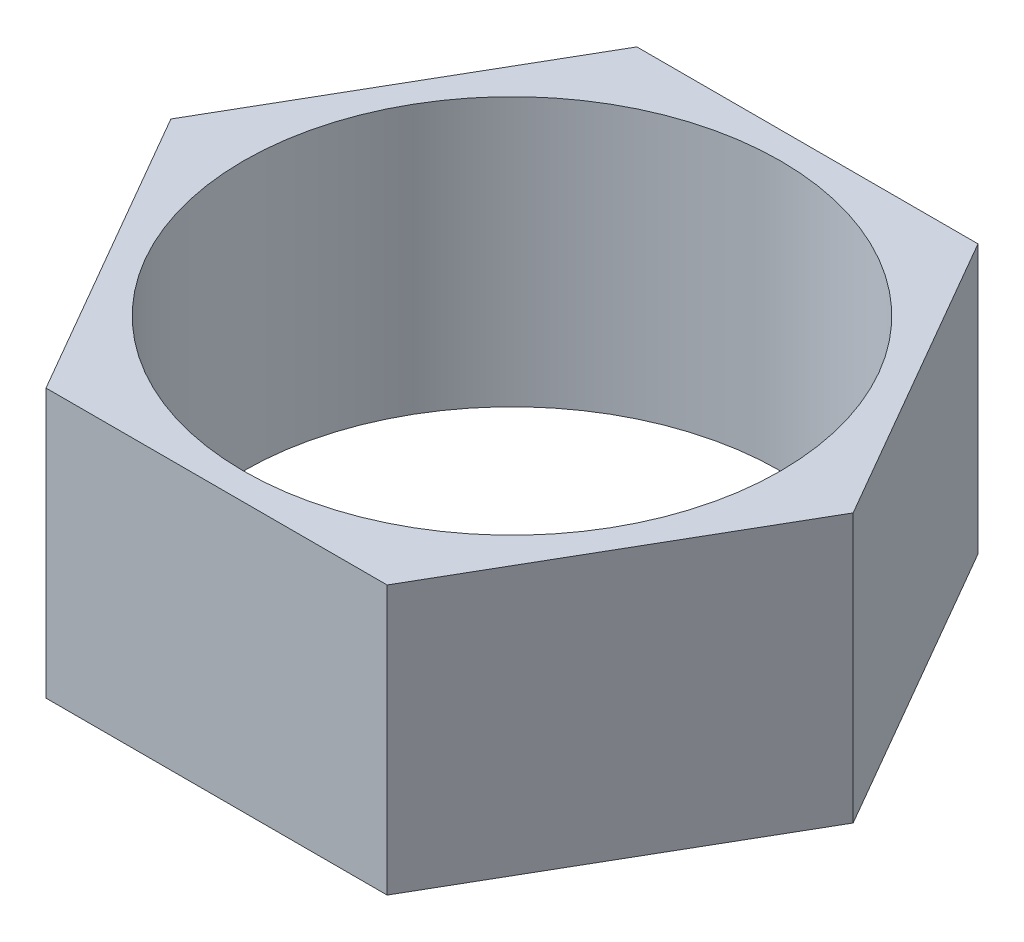
ISO-10303-21;
HEADER;
FILE_DESCRIPTION(('STEP AP214'),'2;1');
FILE_NAME('part.step','',(''),(''),'','','');
FILE_SCHEMA(('AUTOMOTIVE_DESIGN { 1 0 10303 214 1 1 1 1 }'));
ENDSEC;
DATA;
#1=APPLICATION_CONTEXT('core data for automotive mechanical design processes');
#2=APPLICATION_PROTOCOL_DEFINITION('international standard','automotive_design',2000,#1);
#3=PRODUCT_CONTEXT('',#1,'mechanical');
#4=PRODUCT('Part','Part','',(#3));
#5=PRODUCT_RELATED_PRODUCT_CATEGORY('part','',(#4));
#6=PRODUCT_DEFINITION_FORMATION('','',#4);
#7=PRODUCT_DEFINITION_CONTEXT('part definition',#1,'design');
#8=PRODUCT_DEFINITION('design','',#6,#7);
#9=PRODUCT_DEFINITION_SHAPE('','',#8);
#10=(LENGTH_UNIT() NAMED_UNIT(*) SI_UNIT(.MILLI.,.METRE.));
#11=(NAMED_UNIT(*) PLANE_ANGLE_UNIT() SI_UNIT($,.RADIAN.));
#12=(NAMED_UNIT(*) SI_UNIT($,.STERADIAN.) SOLID_ANGLE_UNIT());
#13=UNCERTAINTY_MEASURE_WITH_UNIT(LENGTH_MEASURE(1.E-05),#10,'distance_accuracy_value','');
#14=(GEOMETRIC_REPRESENTATION_CONTEXT(3) GLOBAL_UNCERTAINTY_ASSIGNED_CONTEXT((#13)) GLOBAL_UNIT_ASSIGNED_CONTEXT((#10,
#11,#12)) REPRESENTATION_CONTEXT('',''));
#15=CARTESIAN_POINT('',(0.,0.,0.));
#16=DIRECTION('',(0.,0.,1.));
#17=DIRECTION('',(1.,0.,0.));
#18=AXIS2_PLACEMENT_3D('',#15,#16,#17);
#19=CARTESIAN_POINT('',(0.,10.,0.));
#20=DIRECTION('',(0.,1.,0.));
#21=DIRECTION('',(0.,0.,1.));
#22=AXIS2_PLACEMENT_3D('',#19,#20,#21);
#23=PLANE('',#22);
#24=DIRECTION('',(0.5,0.,-0.866025403784439));
#25=VECTOR('',#24,1.);
#26=CARTESIAN_POINT('',(6.35085296108589,10.,11.));
#27=LINE('',#26,#25);
#28=CARTESIAN_POINT('',(6.35085296108589,10.,11.));
#29=VERTEX_POINT('',#28);
#30=CARTESIAN_POINT('',(12.7017059221718,10.,0.));
#31=VERTEX_POINT('',#30);
#32=EDGE_CURVE('E129',#29,#31,#27,.T.);
#33=ORIENTED_EDGE('',*,*,#32,.T.);
#34=DIRECTION('',(-0.5,0.,-0.866025403784439));
#35=VECTOR('',#34,1.);
#36=CARTESIAN_POINT('',(12.7017059221718,10.,0.));
#37=LINE('',#36,#35);
#38=CARTESIAN_POINT('',(6.35085296108589,10.,-11.));
#39=VERTEX_POINT('',#38);
#40=EDGE_CURVE('E87',#31,#39,#37,.T.);
#41=ORIENTED_EDGE('',*,*,#40,.T.);
#42=DIRECTION('',(-1.,0.,0.));
#43=VECTOR('',#42,1.);
#44=CARTESIAN_POINT('',(6.35085296108589,10.,-11.));
#45=LINE('',#44,#43);
#46=CARTESIAN_POINT('',(-6.35085296108589,10.,-11.));
#47=VERTEX_POINT('',#46);
#48=EDGE_CURVE('E100',#39,#47,#45,.T.);
#49=ORIENTED_EDGE('',*,*,#48,.T.);
#50=DIRECTION('',(-0.5,0.,0.866025403784439));
#51=VECTOR('',#50,1.);
#52=CARTESIAN_POINT('',(-6.35085296108589,10.,-11.));
#53=LINE('',#52,#51);
#54=CARTESIAN_POINT('',(-12.7017059221718,10.,0.));
#55=VERTEX_POINT('',#54);
#56=EDGE_CURVE('E94',#47,#55,#53,.T.);
#57=ORIENTED_EDGE('',*,*,#56,.T.);
#58=DIRECTION('',(0.5,0.,0.866025403784438));
#59=VECTOR('',#58,1.);
#60=CARTESIAN_POINT('',(-12.7017059221718,10.,0.));
#61=LINE('',#60,#59);
#62=CARTESIAN_POINT('',(-6.35085296108589,10.,11.));
#63=VERTEX_POINT('',#62);
#64=EDGE_CURVE('E98',#55,#63,#61,.T.);
#65=ORIENTED_EDGE('',*,*,#64,.T.);
#66=DIRECTION('',(1.,0.,0.));
#67=VECTOR('',#66,1.);
#68=CARTESIAN_POINT('',(-6.35085296108589,10.,11.));
#69=LINE('',#68,#67);
#70=EDGE_CURVE('E50',#63,#29,#69,.T.);
#71=ORIENTED_EDGE('',*,*,#70,.T.);
#72=EDGE_LOOP('',(#33,#41,#49,#57,#65,#71));
#73=FACE_BOUND('',#72,.T.);
#74=CARTESIAN_POINT('',(0.,10.,0.));
#75=DIRECTION('',(0.,1.,0.));
#76=DIRECTION('',(0.,0.,1.));
#77=AXIS2_PLACEMENT_3D('',#74,#75,#76);
#78=CIRCLE('',#77,10.);
#79=CARTESIAN_POINT('',(0.,10.,10.));
#80=VERTEX_POINT('',#79);
#81=EDGE_CURVE('E122',#80,#80,#78,.T.);
#82=ORIENTED_EDGE('',*,*,#81,.F.);
#83=EDGE_LOOP('',(#82));
#84=FACE_BOUND('',#83,.T.);
#85=ADVANCED_FACE('F33',(#73,#84),#23,.T.);
#86=CARTESIAN_POINT('',(0.,0.,0.));
#87=DIRECTION('',(0.,1.,0.));
#88=DIRECTION('',(0.,0.,1.));
#89=AXIS2_PLACEMENT_3D('',#86,#87,#88);
#90=PLANE('',#89);
#91=DIRECTION('',(0.5,0.,-0.866025403784439));
#92=VECTOR('',#91,1.);
#93=CARTESIAN_POINT('',(6.35085296108589,0.,11.));
#94=LINE('',#93,#92);
#95=CARTESIAN_POINT('',(6.35085296108589,0.,11.));
#96=VERTEX_POINT('',#95);
#97=CARTESIAN_POINT('',(12.7017059221718,0.,0.));
#98=VERTEX_POINT('',#97);
#99=EDGE_CURVE('E118',#96,#98,#94,.T.);
#100=ORIENTED_EDGE('',*,*,#99,.F.);
#101=DIRECTION('',(1.,0.,0.));
#102=VECTOR('',#101,1.);
#103=CARTESIAN_POINT('',(-6.35085296108589,0.,11.));
#104=LINE('',#103,#102);
#105=CARTESIAN_POINT('',(-6.35085296108589,0.,11.));
#106=VERTEX_POINT('',#105);
#107=EDGE_CURVE('E79',#106,#96,#104,.T.);
#108=ORIENTED_EDGE('',*,*,#107,.F.);
#109=DIRECTION('',(0.5,0.,0.866025403784438));
#110=VECTOR('',#109,1.);
#111=CARTESIAN_POINT('',(-12.7017059221718,0.,0.));
#112=LINE('',#111,#110);
#113=CARTESIAN_POINT('',(-12.7017059221718,0.,0.));
#114=VERTEX_POINT('',#113);
#115=EDGE_CURVE('E73',#114,#106,#112,.T.);
#116=ORIENTED_EDGE('',*,*,#115,.F.);
#117=DIRECTION('',(-0.5,0.,0.866025403784439));
#118=VECTOR('',#117,1.);
#119=CARTESIAN_POINT('',(-6.35085296108589,0.,-11.));
#120=LINE('',#119,#118);
#121=CARTESIAN_POINT('',(-6.35085296108589,0.,-11.));
#122=VERTEX_POINT('',#121);
#123=EDGE_CURVE('E108',#122,#114,#120,.T.);
#124=ORIENTED_EDGE('',*,*,#123,.F.);
#125=DIRECTION('',(-1.,0.,0.));
#126=VECTOR('',#125,1.);
#127=CARTESIAN_POINT('',(6.35085296108589,0.,-11.));
#128=LINE('',#127,#126);
#129=CARTESIAN_POINT('',(6.35085296108589,0.,-11.));
#130=VERTEX_POINT('',#129);
#131=EDGE_CURVE('E124',#130,#122,#128,.T.);
#132=ORIENTED_EDGE('',*,*,#131,.F.);
#133=DIRECTION('',(-0.5,0.,-0.866025403784439));
#134=VECTOR('',#133,1.);
#135=CARTESIAN_POINT('',(12.7017059221718,0.,0.));
#136=LINE('',#135,#134);
#137=EDGE_CURVE('E121',#98,#130,#136,.T.);
#138=ORIENTED_EDGE('',*,*,#137,.F.);
#139=EDGE_LOOP('',(#100,#108,#116,#124,#132,#138));
#140=FACE_BOUND('',#139,.T.);
#141=CARTESIAN_POINT('',(0.,0.,0.));
#142=DIRECTION('',(0.,1.,0.));
#143=DIRECTION('',(0.,0.,1.));
#144=AXIS2_PLACEMENT_3D('',#141,#142,#143);
#145=CIRCLE('',#144,10.);
#146=CARTESIAN_POINT('',(0.,0.,10.));
#147=VERTEX_POINT('',#146);
#148=EDGE_CURVE('E222',#147,#147,#145,.T.);
#149=ORIENTED_EDGE('',*,*,#148,.T.);
#150=EDGE_LOOP('',(#149));
#151=FACE_BOUND('',#150,.T.);
#152=ADVANCED_FACE('F138',(#140,#151),#90,.F.);
#153=CARTESIAN_POINT('',(6.35085296108589,10.,11.));
#154=DIRECTION('',(-0.866025403784439,0.,-0.5));
#155=DIRECTION('',(-0.5,0.,0.866025403784439));
#156=AXIS2_PLACEMENT_3D('',#153,#154,#155);
#157=PLANE('',#156);
#158=ORIENTED_EDGE('',*,*,#99,.T.);
#159=DIRECTION('',(0.,-1.,0.));
#160=VECTOR('',#159,1.);
#161=CARTESIAN_POINT('',(12.7017059221718,10.,0.));
#162=LINE('',#161,#160);
#163=EDGE_CURVE('E11',#31,#98,#162,.T.);
#164=ORIENTED_EDGE('',*,*,#163,.F.);
#165=ORIENTED_EDGE('',*,*,#32,.F.);
#166=DIRECTION('',(0.,-1.,0.));
#167=VECTOR('',#166,1.);
#168=CARTESIAN_POINT('',(6.35085296108589,10.,11.));
#169=LINE('',#168,#167);
#170=EDGE_CURVE('E114',#29,#96,#169,.T.);
#171=ORIENTED_EDGE('',*,*,#170,.T.);
#172=EDGE_LOOP('',(#158,#164,#165,#171));
#173=FACE_BOUND('',#172,.T.);
#174=ADVANCED_FACE('F35',(#173),#157,.F.);
#175=CARTESIAN_POINT('',(12.7017059221718,10.,0.));
#176=DIRECTION('',(-0.866025403784438,0.,0.5));
#177=DIRECTION('',(0.5,0.,0.866025403784439));
#178=AXIS2_PLACEMENT_3D('',#175,#176,#177);
#179=PLANE('',#178);
#180=ORIENTED_EDGE('',*,*,#137,.T.);
#181=DIRECTION('',(0.,-1.,0.));
#182=VECTOR('',#181,1.);
#183=CARTESIAN_POINT('',(6.35085296108589,10.,-11.));
#184=LINE('',#183,#182);
#185=EDGE_CURVE('E42',#39,#130,#184,.T.);
#186=ORIENTED_EDGE('',*,*,#185,.F.);
#187=ORIENTED_EDGE('',*,*,#40,.F.);
#188=ORIENTED_EDGE('',*,*,#163,.T.);
#189=EDGE_LOOP('',(#180,#186,#187,#188));
#190=FACE_BOUND('',#189,.T.);
#191=ADVANCED_FACE('F163',(#190),#179,.F.);
#192=CARTESIAN_POINT('',(6.35085296108589,10.,-11.));
#193=DIRECTION('',(0.,0.,1.));
#194=DIRECTION('',(1.,0.,0.));
#195=AXIS2_PLACEMENT_3D('',#192,#193,#194);
#196=PLANE('',#195);
#197=ORIENTED_EDGE('',*,*,#131,.T.);
#198=DIRECTION('',(0.,-1.,0.));
#199=VECTOR('',#198,1.);
#200=CARTESIAN_POINT('',(-6.35085296108589,10.,-11.));
#201=LINE('',#200,#199);
#202=EDGE_CURVE('E109',#47,#122,#201,.T.);
#203=ORIENTED_EDGE('',*,*,#202,.F.);
#204=ORIENTED_EDGE('',*,*,#48,.F.);
#205=ORIENTED_EDGE('',*,*,#185,.T.);
#206=EDGE_LOOP('',(#197,#203,#204,#205));
#207=FACE_BOUND('',#206,.T.);
#208=ADVANCED_FACE('F135',(#207),#196,.F.);
#209=CARTESIAN_POINT('',(-6.35085296108589,10.,-11.));
#210=DIRECTION('',(0.866025403784439,0.,0.5));
#211=DIRECTION('',(0.5,0.,-0.866025403784439));
#212=AXIS2_PLACEMENT_3D('',#209,#210,#211);
#213=PLANE('',#212);
#214=ORIENTED_EDGE('',*,*,#123,.T.);
#215=DIRECTION('',(0.,-1.,0.));
#216=VECTOR('',#215,1.);
#217=CARTESIAN_POINT('',(-12.7017059221718,10.,0.));
#218=LINE('',#217,#216);
#219=EDGE_CURVE('E105',#55,#114,#218,.T.);
#220=ORIENTED_EDGE('',*,*,#219,.F.);
#221=ORIENTED_EDGE('',*,*,#56,.F.);
#222=ORIENTED_EDGE('',*,*,#202,.T.);
#223=EDGE_LOOP('',(#214,#220,#221,#222));
#224=FACE_BOUND('',#223,.T.);
#225=ADVANCED_FACE('F106',(#224),#213,.F.);
#226=CARTESIAN_POINT('',(-12.7017059221718,10.,0.));
#227=DIRECTION('',(0.866025403784439,0.,-0.5));
#228=DIRECTION('',(-0.5,0.,-0.866025403784439));
#229=AXIS2_PLACEMENT_3D('',#226,#227,#228);
#230=PLANE('',#229);
#231=ORIENTED_EDGE('',*,*,#115,.T.);
#232=DIRECTION('',(0.,-1.,0.));
#233=VECTOR('',#232,1.);
#234=CARTESIAN_POINT('',(-6.35085296108589,10.,11.));
#235=LINE('',#234,#233);
#236=EDGE_CURVE('E110',#63,#106,#235,.T.);
#237=ORIENTED_EDGE('',*,*,#236,.F.);
#238=ORIENTED_EDGE('',*,*,#64,.F.);
#239=ORIENTED_EDGE('',*,*,#219,.T.);
#240=EDGE_LOOP('',(#231,#237,#238,#239));
#241=FACE_BOUND('',#240,.T.);
#242=ADVANCED_FACE('F112',(#241),#230,.F.);
#243=CARTESIAN_POINT('',(-6.35085296108589,10.,11.));
#244=DIRECTION('',(0.,0.,-1.));
#245=DIRECTION('',(-1.,0.,0.));
#246=AXIS2_PLACEMENT_3D('',#243,#244,#245);
#247=PLANE('',#246);
#248=ORIENTED_EDGE('',*,*,#107,.T.);
#249=ORIENTED_EDGE('',*,*,#170,.F.);
#250=ORIENTED_EDGE('',*,*,#70,.F.);
#251=ORIENTED_EDGE('',*,*,#236,.T.);
#252=EDGE_LOOP('',(#248,#249,#250,#251));
#253=FACE_BOUND('',#252,.T.);
#254=ADVANCED_FACE('F143',(#253),#247,.F.);
#255=CARTESIAN_POINT('',(0.,10.,0.));
#256=DIRECTION('',(0.,-1.,0.));
#257=DIRECTION('',(0.,0.,-1.));
#258=AXIS2_PLACEMENT_3D('',#255,#256,#257);
#259=CYLINDRICAL_SURFACE('',#258,10.);
#260=ORIENTED_EDGE('',*,*,#81,.T.);
#261=EDGE_LOOP('',(#260));
#262=FACE_BOUND('',#261,.T.);
#263=ORIENTED_EDGE('',*,*,#148,.F.);
#264=EDGE_LOOP('',(#263));
#265=FACE_BOUND('',#264,.T.);
#266=ADVANCED_FACE('F145',(#262,#265),#259,.F.);
#267=CLOSED_SHELL('',(#85,#152,#174,#191,#208,#225,#242,#254,#266));
#268=MANIFOLD_SOLID_BREP('B2',#267);
#269=ADVANCED_BREP_SHAPE_REPRESENTATION('',(#18,#268),#14);
#270=SHAPE_DEFINITION_REPRESENTATION(#9,#269);
ENDSEC;
END-ISO-10303-21;
